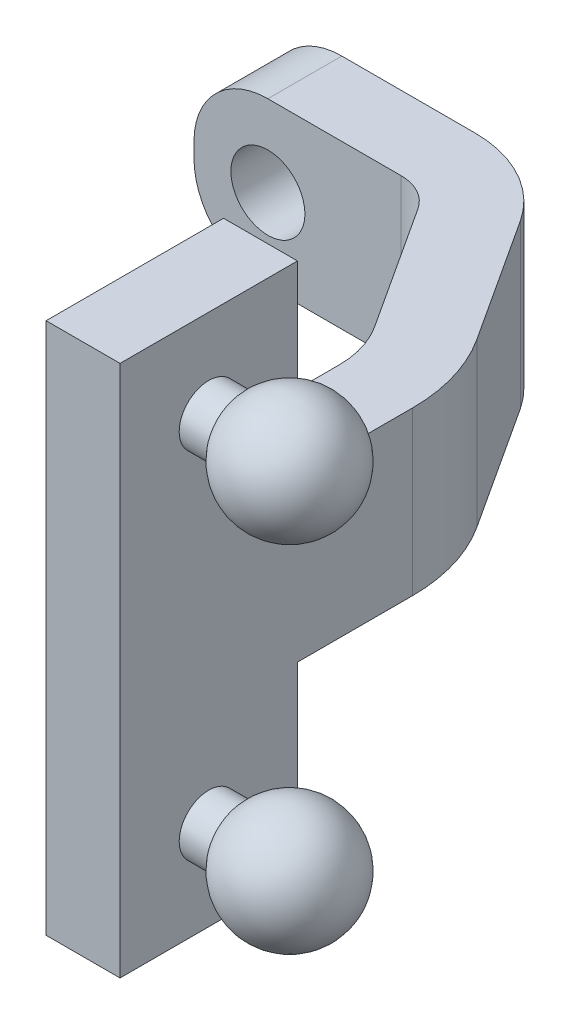
ISO-10303-21;
HEADER;
FILE_DESCRIPTION(('STEP AP214'),'2;1');
FILE_NAME('part.step','',(''),(''),'','','');
FILE_SCHEMA(('AUTOMOTIVE_DESIGN { 1 0 10303 214 1 1 1 1 }'));
ENDSEC;
DATA;
#1=APPLICATION_CONTEXT('core data for automotive mechanical design processes');
#2=APPLICATION_PROTOCOL_DEFINITION('international standard','automotive_design',2000,#1);
#3=PRODUCT_CONTEXT('',#1,'mechanical');
#4=PRODUCT('Part','Part','',(#3));
#5=PRODUCT_RELATED_PRODUCT_CATEGORY('part','',(#4));
#6=PRODUCT_DEFINITION_FORMATION('','',#4);
#7=PRODUCT_DEFINITION_CONTEXT('part definition',#1,'design');
#8=PRODUCT_DEFINITION('design','',#6,#7);
#9=PRODUCT_DEFINITION_SHAPE('','',#8);
#10=(LENGTH_UNIT() NAMED_UNIT(*) SI_UNIT(.MILLI.,.METRE.));
#11=(NAMED_UNIT(*) PLANE_ANGLE_UNIT() SI_UNIT($,.RADIAN.));
#12=(NAMED_UNIT(*) SI_UNIT($,.STERADIAN.) SOLID_ANGLE_UNIT());
#13=UNCERTAINTY_MEASURE_WITH_UNIT(LENGTH_MEASURE(1.E-05),#10,'distance_accuracy_value','');
#14=(GEOMETRIC_REPRESENTATION_CONTEXT(3) GLOBAL_UNCERTAINTY_ASSIGNED_CONTEXT((#13)) GLOBAL_UNIT_ASSIGNED_CONTEXT((#10,
#11,#12)) REPRESENTATION_CONTEXT('',''));
#15=CARTESIAN_POINT('',(0.,0.,0.));
#16=DIRECTION('',(0.,0.,1.));
#17=DIRECTION('',(1.,0.,0.));
#18=AXIS2_PLACEMENT_3D('',#15,#16,#17);
#19=CARTESIAN_POINT('',(0.,2.75,0.));
#20=DIRECTION('',(1.,0.,0.));
#21=DIRECTION('',(0.,0.,-1.));
#22=AXIS2_PLACEMENT_3D('',#19,#20,#21);
#23=PLANE('',#22);
#24=DIRECTION('',(0.,-1.,0.));
#25=VECTOR('',#24,1.);
#26=CARTESIAN_POINT('',(0.,2.75,0.));
#27=LINE('',#26,#25);
#28=CARTESIAN_POINT('',(0.,0.25,0.));
#29=VERTEX_POINT('',#28);
#30=CARTESIAN_POINT('',(0.,-0.25,0.));
#31=VERTEX_POINT('',#30);
#32=EDGE_CURVE('E245',#29,#31,#27,.T.);
#33=ORIENTED_EDGE('',*,*,#32,.T.);
#34=DIRECTION('',(0.,0.,1.));
#35=VECTOR('',#34,1.);
#36=CARTESIAN_POINT('',(0.,-0.25,2.5));
#37=LINE('',#36,#35);
#38=CARTESIAN_POINT('',(0.,-0.25,2.5));
#39=VERTEX_POINT('',#38);
#40=EDGE_CURVE('E296',#31,#39,#37,.T.);
#41=ORIENTED_EDGE('',*,*,#40,.T.);
#42=DIRECTION('',(0.,-1.,0.));
#43=VECTOR('',#42,1.);
#44=CARTESIAN_POINT('',(0.,2.75,2.5));
#45=LINE('',#44,#43);
#46=CARTESIAN_POINT('',(0.,0.25,2.5));
#47=VERTEX_POINT('',#46);
#48=EDGE_CURVE('E291',#47,#39,#45,.T.);
#49=ORIENTED_EDGE('',*,*,#48,.F.);
#50=DIRECTION('',(0.,0.,1.));
#51=VECTOR('',#50,1.);
#52=CARTESIAN_POINT('',(0.,0.25,0.));
#53=LINE('',#52,#51);
#54=EDGE_CURVE('E294',#47,#29,#53,.F.);
#55=ORIENTED_EDGE('',*,*,#54,.T.);
#56=EDGE_LOOP('',(#33,#41,#49,#55));
#57=FACE_BOUND('',#56,.T.);
#58=ADVANCED_FACE('F41',(#57),#23,.F.);
#59=CARTESIAN_POINT('',(0.,2.75,2.5));
#60=DIRECTION('',(0.,0.,-1.));
#61=DIRECTION('',(-1.,0.,0.));
#62=AXIS2_PLACEMENT_3D('',#59,#60,#61);
#63=PLANE('',#62);
#64=CARTESIAN_POINT('',(2.5,0.,2.5));
#65=DIRECTION('',(0.,0.,-1.));
#66=DIRECTION('',(-1.,0.,0.));
#67=AXIS2_PLACEMENT_3D('',#64,#65,#66);
#68=CIRCLE('',#67,1.25);
#69=CARTESIAN_POINT('',(1.25,0.,2.5));
#70=VERTEX_POINT('',#69);
#71=EDGE_CURVE('E220',#70,#70,#68,.T.);
#72=ORIENTED_EDGE('',*,*,#71,.T.);
#73=EDGE_LOOP('',(#72));
#74=FACE_BOUND('',#73,.T.);
#75=ORIENTED_EDGE('',*,*,#48,.T.);
#76=CARTESIAN_POINT('',(2.5,-0.25,2.5));
#77=DIRECTION('',(0.,0.,-1.));
#78=DIRECTION('',(-1.,0.,0.));
#79=AXIS2_PLACEMENT_3D('',#76,#77,#78);
#80=CIRCLE('',#79,2.5);
#81=CARTESIAN_POINT('',(2.5,-2.75,2.5));
#82=VERTEX_POINT('',#81);
#83=EDGE_CURVE('E301',#39,#82,#80,.F.);
#84=ORIENTED_EDGE('',*,*,#83,.T.);
#85=DIRECTION('',(1.,0.,0.));
#86=VECTOR('',#85,1.);
#87=CARTESIAN_POINT('',(0.,-2.75,2.5));
#88=LINE('',#87,#86);
#89=CARTESIAN_POINT('',(7.,-2.75,2.5));
#90=VERTEX_POINT('',#89);
#91=EDGE_CURVE('E223',#82,#90,#88,.T.);
#92=ORIENTED_EDGE('',*,*,#91,.T.);
#93=DIRECTION('',(0.,-1.,0.));
#94=VECTOR('',#93,1.);
#95=CARTESIAN_POINT('',(7.,2.75,2.5));
#96=LINE('',#95,#94);
#97=CARTESIAN_POINT('',(7.,2.75,2.5));
#98=VERTEX_POINT('',#97);
#99=EDGE_CURVE('E288',#98,#90,#96,.T.);
#100=ORIENTED_EDGE('',*,*,#99,.F.);
#101=DIRECTION('',(1.,0.,0.));
#102=VECTOR('',#101,1.);
#103=CARTESIAN_POINT('',(0.,2.75,2.5));
#104=LINE('',#103,#102);
#105=CARTESIAN_POINT('',(2.5,2.75,2.5));
#106=VERTEX_POINT('',#105);
#107=EDGE_CURVE('E224',#106,#98,#104,.T.);
#108=ORIENTED_EDGE('',*,*,#107,.F.);
#109=CARTESIAN_POINT('',(2.5,0.25,2.5));
#110=DIRECTION('',(0.,0.,-1.));
#111=DIRECTION('',(-1.,0.,0.));
#112=AXIS2_PLACEMENT_3D('',#109,#110,#111);
#113=CIRCLE('',#112,2.5);
#114=EDGE_CURVE('E299',#106,#47,#113,.F.);
#115=ORIENTED_EDGE('',*,*,#114,.T.);
#116=EDGE_LOOP('',(#75,#84,#92,#100,#108,#115));
#117=FACE_BOUND('',#116,.T.);
#118=ADVANCED_FACE('F384',(#74,#117),#63,.F.);
#119=CARTESIAN_POINT('',(7.,2.75,4.));
#120=DIRECTION('',(0.,-1.,0.));
#121=DIRECTION('',(0.,0.,-1.));
#122=AXIS2_PLACEMENT_3D('',#119,#120,#121);
#123=CYLINDRICAL_SURFACE('',#122,1.5);
#124=CARTESIAN_POINT('',(7.,-2.75,4.));
#125=DIRECTION('',(0.,-1.,0.));
#126=DIRECTION('',(0.,0.,-1.));
#127=AXIS2_PLACEMENT_3D('',#124,#125,#126);
#128=CIRCLE('',#127,1.5);
#129=CARTESIAN_POINT('',(8.25754577081105,-2.75,3.18233342106012));
#130=VERTEX_POINT('',#129);
#131=EDGE_CURVE('E247',#90,#130,#128,.T.);
#132=ORIENTED_EDGE('',*,*,#131,.T.);
#133=DIRECTION('',(0.,-1.,0.));
#134=VECTOR('',#133,1.);
#135=CARTESIAN_POINT('',(8.25754577081105,2.75,3.18233342106012));
#136=LINE('',#135,#134);
#137=CARTESIAN_POINT('',(8.25754577081105,2.75,3.18233342106012));
#138=VERTEX_POINT('',#137);
#139=EDGE_CURVE('E285',#138,#130,#136,.T.);
#140=ORIENTED_EDGE('',*,*,#139,.F.);
#141=CARTESIAN_POINT('',(7.,2.75,4.));
#142=DIRECTION('',(0.,-1.,0.));
#143=DIRECTION('',(0.,0.,-1.));
#144=AXIS2_PLACEMENT_3D('',#141,#142,#143);
#145=CIRCLE('',#144,1.5);
#146=EDGE_CURVE('E226',#98,#138,#145,.T.);
#147=ORIENTED_EDGE('',*,*,#146,.F.);
#148=ORIENTED_EDGE('',*,*,#99,.T.);
#149=EDGE_LOOP('',(#132,#140,#147,#148));
#150=FACE_BOUND('',#149,.T.);
#151=ADVANCED_FACE('F347',(#150),#123,.F.);
#152=CARTESIAN_POINT('',(8.25754577081105,2.75,3.18233342106012));
#153=DIRECTION('',(0.838363847207363,0.,-0.54511105262659));
#154=DIRECTION('',(-0.54511105262659,0.,-0.838363847207363));
#155=AXIS2_PLACEMENT_3D('',#152,#153,#154);
#156=PLANE('',#155);
#157=DIRECTION('',(0.54511105262659,0.,0.838363847207363));
#158=VECTOR('',#157,1.);
#159=CARTESIAN_POINT('',(8.25754577081105,-2.75,3.18233342106012));
#160=LINE('',#159,#158);
#161=CARTESIAN_POINT('',(10.9902966016318,-2.75,7.38521921643481));
#162=VERTEX_POINT('',#161);
#163=EDGE_CURVE('E249',#130,#162,#160,.T.);
#164=ORIENTED_EDGE('',*,*,#163,.T.);
#165=DIRECTION('',(0.,-1.,0.));
#166=VECTOR('',#165,1.);
#167=CARTESIAN_POINT('',(10.9902966016318,2.75,7.38521921643481));
#168=LINE('',#167,#166);
#169=CARTESIAN_POINT('',(10.9902966016318,2.75,7.38521921643481));
#170=VERTEX_POINT('',#169);
#171=EDGE_CURVE('E282',#170,#162,#168,.T.);
#172=ORIENTED_EDGE('',*,*,#171,.F.);
#173=DIRECTION('',(0.54511105262659,0.,0.838363847207363));
#174=VECTOR('',#173,1.);
#175=CARTESIAN_POINT('',(8.25754577081105,2.75,3.18233342106012));
#176=LINE('',#175,#174);
#177=EDGE_CURVE('E229',#138,#170,#176,.T.);
#178=ORIENTED_EDGE('',*,*,#177,.F.);
#179=ORIENTED_EDGE('',*,*,#139,.T.);
#180=EDGE_LOOP('',(#164,#172,#178,#179));
#181=FACE_BOUND('',#180,.T.);
#182=ADVANCED_FACE('F343',(#181),#156,.F.);
#183=CARTESIAN_POINT('',(8.34660028365028,2.75,9.10417225516659));
#184=DIRECTION('',(0.,-1.,0.));
#185=DIRECTION('',(0.,0.,-1.));
#186=AXIS2_PLACEMENT_3D('',#183,#184,#185);
#187=CYLINDRICAL_SURFACE('',#186,3.15339971634972);
#188=CARTESIAN_POINT('',(8.34660028365028,-2.75,9.10417225516659));
#189=DIRECTION('',(0.,-1.,0.));
#190=DIRECTION('',(0.,0.,1.));
#191=AXIS2_PLACEMENT_3D('',#188,#189,#190);
#192=CIRCLE('',#191,3.15339971634972);
#193=CARTESIAN_POINT('',(11.5,-2.75,9.10417225516659));
#194=VERTEX_POINT('',#193);
#195=EDGE_CURVE('E251',#162,#194,#192,.T.);
#196=ORIENTED_EDGE('',*,*,#195,.T.);
#197=DIRECTION('',(0.,-1.,0.));
#198=VECTOR('',#197,1.);
#199=CARTESIAN_POINT('',(11.5,2.75,9.10417225516659));
#200=LINE('',#199,#198);
#201=CARTESIAN_POINT('',(11.5,2.75,9.10417225516659));
#202=VERTEX_POINT('',#201);
#203=EDGE_CURVE('E179',#202,#194,#200,.T.);
#204=ORIENTED_EDGE('',*,*,#203,.F.);
#205=CARTESIAN_POINT('',(8.34660028365028,2.75,9.10417225516659));
#206=DIRECTION('',(0.,-1.,0.));
#207=DIRECTION('',(0.,0.,1.));
#208=AXIS2_PLACEMENT_3D('',#205,#206,#207);
#209=CIRCLE('',#208,3.15339971634972);
#210=EDGE_CURVE('E231',#170,#202,#209,.T.);
#211=ORIENTED_EDGE('',*,*,#210,.F.);
#212=ORIENTED_EDGE('',*,*,#171,.T.);
#213=EDGE_LOOP('',(#196,#204,#211,#212));
#214=FACE_BOUND('',#213,.T.);
#215=ADVANCED_FACE('F339',(#214),#187,.F.);
#216=CARTESIAN_POINT('',(11.5,2.75,9.10417225516659));
#217=DIRECTION('',(1.,0.,0.));
#218=DIRECTION('',(0.,0.,-1.));
#219=AXIS2_PLACEMENT_3D('',#216,#217,#218);
#220=PLANE('',#219);
#221=DIRECTION('',(0.,0.,1.));
#222=VECTOR('',#221,1.);
#223=CARTESIAN_POINT('',(11.5,-2.75,9.10417225516659));
#224=LINE('',#223,#222);
#225=CARTESIAN_POINT('',(11.5,-2.75,13.));
#226=VERTEX_POINT('',#225);
#227=EDGE_CURVE('E253',#194,#226,#224,.T.);
#228=ORIENTED_EDGE('',*,*,#227,.T.);
#229=DIRECTION('',(0.,-1.,0.));
#230=VECTOR('',#229,1.);
#231=CARTESIAN_POINT('',(11.5,8.99999999999999,13.));
#232=LINE('',#231,#230);
#233=CARTESIAN_POINT('',(11.5,-9.,13.));
#234=VERTEX_POINT('',#233);
#235=EDGE_CURVE('E193',#226,#234,#232,.T.);
#236=ORIENTED_EDGE('',*,*,#235,.T.);
#237=DIRECTION('',(0.,0.,1.));
#238=VECTOR('',#237,1.);
#239=CARTESIAN_POINT('',(11.5,-9.,13.));
#240=LINE('',#239,#238);
#241=CARTESIAN_POINT('',(11.5,-9.,19.));
#242=VERTEX_POINT('',#241);
#243=EDGE_CURVE('E175',#234,#242,#240,.T.);
#244=ORIENTED_EDGE('',*,*,#243,.T.);
#245=DIRECTION('',(0.,-1.,0.));
#246=VECTOR('',#245,1.);
#247=CARTESIAN_POINT('',(11.5,2.75,19.));
#248=LINE('',#247,#246);
#249=CARTESIAN_POINT('',(11.5,9.,19.));
#250=VERTEX_POINT('',#249);
#251=EDGE_CURVE('E167',#250,#242,#248,.T.);
#252=ORIENTED_EDGE('',*,*,#251,.F.);
#253=DIRECTION('',(0.,0.,-1.));
#254=VECTOR('',#253,1.);
#255=CARTESIAN_POINT('',(11.5,8.99999999999999,13.));
#256=LINE('',#255,#254);
#257=CARTESIAN_POINT('',(11.5,8.99999999999999,13.));
#258=VERTEX_POINT('',#257);
#259=EDGE_CURVE('E173',#250,#258,#256,.T.);
#260=ORIENTED_EDGE('',*,*,#259,.T.);
#261=CARTESIAN_POINT('',(11.5,2.75,13.));
#262=VERTEX_POINT('',#261);
#263=EDGE_CURVE('E196',#258,#262,#232,.T.);
#264=ORIENTED_EDGE('',*,*,#263,.T.);
#265=DIRECTION('',(0.,0.,1.));
#266=VECTOR('',#265,1.);
#267=CARTESIAN_POINT('',(11.5,2.75,9.10417225516659));
#268=LINE('',#267,#266);
#269=EDGE_CURVE('E56',#202,#262,#268,.T.);
#270=ORIENTED_EDGE('',*,*,#269,.F.);
#271=ORIENTED_EDGE('',*,*,#203,.T.);
#272=EDGE_LOOP('',(#228,#236,#244,#252,#260,#264,#270,#271));
#273=FACE_BOUND('',#272,.T.);
#274=ADVANCED_FACE('F170',(#273),#220,.F.);
#275=CARTESIAN_POINT('',(11.5,2.75,19.));
#276=DIRECTION('',(0.,0.,-1.));
#277=DIRECTION('',(-1.,0.,0.));
#278=AXIS2_PLACEMENT_3D('',#275,#276,#277);
#279=PLANE('',#278);
#280=ORIENTED_EDGE('',*,*,#251,.T.);
#281=DIRECTION('',(-1.,0.,0.));
#282=VECTOR('',#281,1.);
#283=CARTESIAN_POINT('',(32.9736659610103,-9.,19.));
#284=LINE('',#283,#282);
#285=CARTESIAN_POINT('',(14.,-9.,19.));
#286=VERTEX_POINT('',#285);
#287=EDGE_CURVE('E206',#286,#242,#284,.T.);
#288=ORIENTED_EDGE('',*,*,#287,.F.);
#289=DIRECTION('',(0.,-1.,0.));
#290=VECTOR('',#289,1.);
#291=CARTESIAN_POINT('',(14.,2.75,19.));
#292=LINE('',#291,#290);
#293=CARTESIAN_POINT('',(14.,9.,19.));
#294=VERTEX_POINT('',#293);
#295=EDGE_CURVE('E180',#294,#286,#292,.T.);
#296=ORIENTED_EDGE('',*,*,#295,.F.);
#297=DIRECTION('',(-1.,0.,0.));
#298=VECTOR('',#297,1.);
#299=CARTESIAN_POINT('',(32.9736659610103,9.,19.));
#300=LINE('',#299,#298);
#301=EDGE_CURVE('E183',#294,#250,#300,.T.);
#302=ORIENTED_EDGE('',*,*,#301,.T.);
#303=EDGE_LOOP('',(#280,#288,#296,#302));
#304=FACE_BOUND('',#303,.T.);
#305=ADVANCED_FACE('F184',(#304),#279,.F.);
#306=CARTESIAN_POINT('',(14.,2.75,9.10417225516659));
#307=DIRECTION('',(-1.,0.,0.));
#308=DIRECTION('',(0.,0.,1.));
#309=AXIS2_PLACEMENT_3D('',#306,#307,#308);
#310=PLANE('',#309);
#311=CARTESIAN_POINT('',(14.,-5.99999999999999,16.));
#312=DIRECTION('',(-1.,0.,0.));
#313=DIRECTION('',(0.,0.,-1.));
#314=AXIS2_PLACEMENT_3D('',#311,#312,#313);
#315=CIRCLE('',#314,1.);
#316=CARTESIAN_POINT('',(14.,-5.99999999999999,15.));
#317=VERTEX_POINT('',#316);
#318=EDGE_CURVE('E199',#317,#317,#315,.T.);
#319=ORIENTED_EDGE('',*,*,#318,.T.);
#320=EDGE_LOOP('',(#319));
#321=FACE_BOUND('',#320,.T.);
#322=CARTESIAN_POINT('',(14.,5.99999999999999,16.));
#323=DIRECTION('',(-1.,0.,0.));
#324=DIRECTION('',(0.,0.,1.));
#325=AXIS2_PLACEMENT_3D('',#322,#323,#324);
#326=CIRCLE('',#325,1.);
#327=CARTESIAN_POINT('',(14.,5.99999999999999,17.));
#328=VERTEX_POINT('',#327);
#329=EDGE_CURVE('E11',#328,#328,#326,.F.);
#330=ORIENTED_EDGE('',*,*,#329,.F.);
#331=EDGE_LOOP('',(#330));
#332=FACE_BOUND('',#331,.T.);
#333=DIRECTION('',(0.,0.,-1.));
#334=VECTOR('',#333,1.);
#335=CARTESIAN_POINT('',(14.,2.75,9.10417225516659));
#336=LINE('',#335,#334);
#337=CARTESIAN_POINT('',(14.,2.75,13.));
#338=VERTEX_POINT('',#337);
#339=CARTESIAN_POINT('',(14.,2.75,9.10417225516659));
#340=VERTEX_POINT('',#339);
#341=EDGE_CURVE('E234',#338,#340,#336,.T.);
#342=ORIENTED_EDGE('',*,*,#341,.F.);
#343=DIRECTION('',(0.,1.,0.));
#344=VECTOR('',#343,1.);
#345=CARTESIAN_POINT('',(14.,8.99999999999999,13.));
#346=LINE('',#345,#344);
#347=CARTESIAN_POINT('',(14.,8.99999999999999,13.));
#348=VERTEX_POINT('',#347);
#349=EDGE_CURVE('E208',#338,#348,#346,.T.);
#350=ORIENTED_EDGE('',*,*,#349,.T.);
#351=DIRECTION('',(0.,0.,1.));
#352=VECTOR('',#351,1.);
#353=CARTESIAN_POINT('',(14.,8.99999999999999,13.));
#354=LINE('',#353,#352);
#355=EDGE_CURVE('E213',#348,#294,#354,.T.);
#356=ORIENTED_EDGE('',*,*,#355,.T.);
#357=ORIENTED_EDGE('',*,*,#295,.T.);
#358=DIRECTION('',(0.,0.,-1.));
#359=VECTOR('',#358,1.);
#360=CARTESIAN_POINT('',(14.,-9.,13.));
#361=LINE('',#360,#359);
#362=CARTESIAN_POINT('',(14.,-9.,13.));
#363=VERTEX_POINT('',#362);
#364=EDGE_CURVE('E202',#286,#363,#361,.T.);
#365=ORIENTED_EDGE('',*,*,#364,.T.);
#366=CARTESIAN_POINT('',(14.,-2.75,13.));
#367=VERTEX_POINT('',#366);
#368=EDGE_CURVE('E64',#363,#367,#346,.T.);
#369=ORIENTED_EDGE('',*,*,#368,.T.);
#370=DIRECTION('',(0.,0.,-1.));
#371=VECTOR('',#370,1.);
#372=CARTESIAN_POINT('',(14.,-2.75,9.10417225516659));
#373=LINE('',#372,#371);
#374=CARTESIAN_POINT('',(14.,-2.75,9.10417225516659));
#375=VERTEX_POINT('',#374);
#376=EDGE_CURVE('E255',#367,#375,#373,.T.);
#377=ORIENTED_EDGE('',*,*,#376,.T.);
#378=DIRECTION('',(0.,-1.,0.));
#379=VECTOR('',#378,1.);
#380=CARTESIAN_POINT('',(14.,2.75,9.10417225516659));
#381=LINE('',#380,#379);
#382=EDGE_CURVE('E276',#340,#375,#381,.T.);
#383=ORIENTED_EDGE('',*,*,#382,.F.);
#384=EDGE_LOOP('',(#342,#350,#356,#357,#365,#369,#377,#383));
#385=FACE_BOUND('',#384,.T.);
#386=ADVANCED_FACE('F322',(#321,#332,#385),#310,.F.);
#387=CARTESIAN_POINT('',(8.34660028365028,2.75,9.10417225516659));
#388=DIRECTION('',(0.,-1.,0.));
#389=DIRECTION('',(0.,0.,-1.));
#390=AXIS2_PLACEMENT_3D('',#387,#388,#389);
#391=CYLINDRICAL_SURFACE('',#390,5.65339971634972);
#392=CARTESIAN_POINT('',(8.34660028365028,-2.75,9.10417225516659));
#393=DIRECTION('',(0.,1.,0.));
#394=DIRECTION('',(0.,0.,-1.));
#395=AXIS2_PLACEMENT_3D('',#392,#393,#394);
#396=CIRCLE('',#395,5.65339971634972);
#397=CARTESIAN_POINT('',(13.0862062196502,-2.75,6.02244158486833));
#398=VERTEX_POINT('',#397);
#399=EDGE_CURVE('E257',#375,#398,#396,.T.);
#400=ORIENTED_EDGE('',*,*,#399,.T.);
#401=DIRECTION('',(0.,-1.,0.));
#402=VECTOR('',#401,1.);
#403=CARTESIAN_POINT('',(13.0862062196502,2.75,6.02244158486833));
#404=LINE('',#403,#402);
#405=CARTESIAN_POINT('',(13.0862062196502,2.75,6.02244158486833));
#406=VERTEX_POINT('',#405);
#407=EDGE_CURVE('E273',#406,#398,#404,.T.);
#408=ORIENTED_EDGE('',*,*,#407,.F.);
#409=CARTESIAN_POINT('',(8.34660028365028,2.75,9.10417225516659));
#410=DIRECTION('',(0.,1.,0.));
#411=DIRECTION('',(0.,0.,-1.));
#412=AXIS2_PLACEMENT_3D('',#409,#410,#411);
#413=CIRCLE('',#412,5.65339971634972);
#414=EDGE_CURVE('E236',#340,#406,#413,.T.);
#415=ORIENTED_EDGE('',*,*,#414,.F.);
#416=ORIENTED_EDGE('',*,*,#382,.T.);
#417=EDGE_LOOP('',(#400,#408,#415,#416));
#418=FACE_BOUND('',#417,.T.);
#419=ADVANCED_FACE('F325',(#418),#391,.T.);
#420=CARTESIAN_POINT('',(10.3534553888295,2.75,1.81955578949364));
#421=DIRECTION('',(-0.838363847207363,0.,0.54511105262659));
#422=DIRECTION('',(0.54511105262659,0.,0.838363847207363));
#423=AXIS2_PLACEMENT_3D('',#420,#421,#422);
#424=PLANE('',#423);
#425=DIRECTION('',(-0.54511105262659,0.,-0.838363847207363));
#426=VECTOR('',#425,1.);
#427=CARTESIAN_POINT('',(10.3534553888295,-2.75,1.81955578949364));
#428=LINE('',#427,#426);
#429=CARTESIAN_POINT('',(10.3534553888295,-2.75,1.81955578949364));
#430=VERTEX_POINT('',#429);
#431=EDGE_CURVE('E259',#398,#430,#428,.T.);
#432=ORIENTED_EDGE('',*,*,#431,.T.);
#433=DIRECTION('',(0.,-1.,0.));
#434=VECTOR('',#433,1.);
#435=CARTESIAN_POINT('',(10.3534553888295,2.75,1.81955578949364));
#436=LINE('',#435,#434);
#437=CARTESIAN_POINT('',(10.3534553888295,2.75,1.81955578949364));
#438=VERTEX_POINT('',#437);
#439=EDGE_CURVE('E270',#438,#430,#436,.T.);
#440=ORIENTED_EDGE('',*,*,#439,.F.);
#441=DIRECTION('',(-0.54511105262659,0.,-0.838363847207363));
#442=VECTOR('',#441,1.);
#443=CARTESIAN_POINT('',(10.3534553888295,2.75,1.81955578949364));
#444=LINE('',#443,#442);
#445=EDGE_CURVE('E238',#406,#438,#444,.T.);
#446=ORIENTED_EDGE('',*,*,#445,.F.);
#447=ORIENTED_EDGE('',*,*,#407,.T.);
#448=EDGE_LOOP('',(#432,#440,#446,#447));
#449=FACE_BOUND('',#448,.T.);
#450=ADVANCED_FACE('F374',(#449),#424,.F.);
#451=CARTESIAN_POINT('',(7.,2.75,4.));
#452=DIRECTION('',(0.,-1.,0.));
#453=DIRECTION('',(0.,0.,-1.));
#454=AXIS2_PLACEMENT_3D('',#451,#452,#453);
#455=CYLINDRICAL_SURFACE('',#454,4.);
#456=CARTESIAN_POINT('',(7.,-2.75,4.));
#457=DIRECTION('',(0.,1.,0.));
#458=DIRECTION('',(0.,0.,-1.));
#459=AXIS2_PLACEMENT_3D('',#456,#457,#458);
#460=CIRCLE('',#459,4.);
#461=CARTESIAN_POINT('',(7.,-2.75,0.));
#462=VERTEX_POINT('',#461);
#463=EDGE_CURVE('E261',#430,#462,#460,.T.);
#464=ORIENTED_EDGE('',*,*,#463,.T.);
#465=DIRECTION('',(0.,-1.,0.));
#466=VECTOR('',#465,1.);
#467=CARTESIAN_POINT('',(7.,2.75,0.));
#468=LINE('',#467,#466);
#469=CARTESIAN_POINT('',(7.,2.75,0.));
#470=VERTEX_POINT('',#469);
#471=EDGE_CURVE('E267',#470,#462,#468,.T.);
#472=ORIENTED_EDGE('',*,*,#471,.F.);
#473=CARTESIAN_POINT('',(7.,2.75,4.));
#474=DIRECTION('',(0.,1.,0.));
#475=DIRECTION('',(0.,0.,-1.));
#476=AXIS2_PLACEMENT_3D('',#473,#474,#475);
#477=CIRCLE('',#476,4.);
#478=EDGE_CURVE('E240',#438,#470,#477,.T.);
#479=ORIENTED_EDGE('',*,*,#478,.F.);
#480=ORIENTED_EDGE('',*,*,#439,.T.);
#481=EDGE_LOOP('',(#464,#472,#479,#480));
#482=FACE_BOUND('',#481,.T.);
#483=ADVANCED_FACE('F371',(#482),#455,.T.);
#484=CARTESIAN_POINT('',(0.,2.75,0.));
#485=DIRECTION('',(0.,0.,1.));
#486=DIRECTION('',(1.,0.,0.));
#487=AXIS2_PLACEMENT_3D('',#484,#485,#486);
#488=PLANE('',#487);
#489=CARTESIAN_POINT('',(2.5,0.,0.));
#490=DIRECTION('',(0.,0.,-1.));
#491=DIRECTION('',(-1.,0.,0.));
#492=AXIS2_PLACEMENT_3D('',#489,#490,#491);
#493=CIRCLE('',#492,1.25);
#494=CARTESIAN_POINT('',(1.25,0.,0.));
#495=VERTEX_POINT('',#494);
#496=EDGE_CURVE('E217',#495,#495,#493,.T.);
#497=ORIENTED_EDGE('',*,*,#496,.F.);
#498=EDGE_LOOP('',(#497));
#499=FACE_BOUND('',#498,.T.);
#500=DIRECTION('',(-1.,0.,0.));
#501=VECTOR('',#500,1.);
#502=CARTESIAN_POINT('',(0.,-2.75,0.));
#503=LINE('',#502,#501);
#504=CARTESIAN_POINT('',(2.5,-2.75,0.));
#505=VERTEX_POINT('',#504);
#506=EDGE_CURVE('E227',#462,#505,#503,.T.);
#507=ORIENTED_EDGE('',*,*,#506,.T.);
#508=CARTESIAN_POINT('',(2.5,-0.25,0.));
#509=DIRECTION('',(0.,0.,1.));
#510=DIRECTION('',(1.,0.,0.));
#511=AXIS2_PLACEMENT_3D('',#508,#509,#510);
#512=CIRCLE('',#511,2.5);
#513=EDGE_CURVE('E307',#505,#31,#512,.F.);
#514=ORIENTED_EDGE('',*,*,#513,.T.);
#515=ORIENTED_EDGE('',*,*,#32,.F.);
#516=CARTESIAN_POINT('',(2.5,0.25,0.));
#517=DIRECTION('',(0.,0.,1.));
#518=DIRECTION('',(1.,0.,0.));
#519=AXIS2_PLACEMENT_3D('',#516,#517,#518);
#520=CIRCLE('',#519,2.5);
#521=CARTESIAN_POINT('',(2.5,2.75,0.));
#522=VERTEX_POINT('',#521);
#523=EDGE_CURVE('E305',#29,#522,#520,.F.);
#524=ORIENTED_EDGE('',*,*,#523,.T.);
#525=DIRECTION('',(-1.,0.,0.));
#526=VECTOR('',#525,1.);
#527=CARTESIAN_POINT('',(0.,2.75,0.));
#528=LINE('',#527,#526);
#529=EDGE_CURVE('E242',#470,#522,#528,.T.);
#530=ORIENTED_EDGE('',*,*,#529,.F.);
#531=ORIENTED_EDGE('',*,*,#471,.T.);
#532=EDGE_LOOP('',(#507,#514,#515,#524,#530,#531));
#533=FACE_BOUND('',#532,.T.);
#534=ADVANCED_FACE('F359',(#499,#533),#488,.F.);
#535=CARTESIAN_POINT('',(7.,2.75,4.));
#536=DIRECTION('',(0.,-1.,0.));
#537=DIRECTION('',(0.,0.,-1.));
#538=AXIS2_PLACEMENT_3D('',#535,#536,#537);
#539=PLANE('',#538);
#540=ORIENTED_EDGE('',*,*,#269,.T.);
#541=DIRECTION('',(1.,0.,0.));
#542=VECTOR('',#541,1.);
#543=CARTESIAN_POINT('',(7.00000000000001,2.75,13.));
#544=LINE('',#543,#542);
#545=EDGE_CURVE('E215',#262,#338,#544,.T.);
#546=ORIENTED_EDGE('',*,*,#545,.T.);
#547=ORIENTED_EDGE('',*,*,#341,.T.);
#548=ORIENTED_EDGE('',*,*,#414,.T.);
#549=ORIENTED_EDGE('',*,*,#445,.T.);
#550=ORIENTED_EDGE('',*,*,#478,.T.);
#551=ORIENTED_EDGE('',*,*,#529,.T.);
#552=DIRECTION('',(0.,0.,1.));
#553=VECTOR('',#552,1.);
#554=CARTESIAN_POINT('',(2.5,2.75,4.));
#555=LINE('',#554,#553);
#556=EDGE_CURVE('E309',#522,#106,#555,.T.);
#557=ORIENTED_EDGE('',*,*,#556,.T.);
#558=ORIENTED_EDGE('',*,*,#107,.T.);
#559=ORIENTED_EDGE('',*,*,#146,.T.);
#560=ORIENTED_EDGE('',*,*,#177,.T.);
#561=ORIENTED_EDGE('',*,*,#210,.T.);
#562=EDGE_LOOP('',(#540,#546,#547,#548,#549,#550,#551,#557,#558,#559,#560,#561));
#563=FACE_BOUND('',#562,.T.);
#564=ADVANCED_FACE('F328',(#563),#539,.F.);
#565=CARTESIAN_POINT('',(7.,-2.75,4.));
#566=DIRECTION('',(0.,-1.,0.));
#567=DIRECTION('',(0.,0.,-1.));
#568=AXIS2_PLACEMENT_3D('',#565,#566,#567);
#569=PLANE('',#568);
#570=DIRECTION('',(1.,0.,0.));
#571=VECTOR('',#570,1.);
#572=CARTESIAN_POINT('',(7.00000000000001,-2.75,13.));
#573=LINE('',#572,#571);
#574=EDGE_CURVE('E49',#226,#367,#573,.T.);
#575=ORIENTED_EDGE('',*,*,#574,.F.);
#576=ORIENTED_EDGE('',*,*,#227,.F.);
#577=ORIENTED_EDGE('',*,*,#195,.F.);
#578=ORIENTED_EDGE('',*,*,#163,.F.);
#579=ORIENTED_EDGE('',*,*,#131,.F.);
#580=ORIENTED_EDGE('',*,*,#91,.F.);
#581=DIRECTION('',(0.,0.,1.));
#582=VECTOR('',#581,1.);
#583=CARTESIAN_POINT('',(2.5,-2.75,0.));
#584=LINE('',#583,#582);
#585=EDGE_CURVE('E303',#82,#505,#584,.F.);
#586=ORIENTED_EDGE('',*,*,#585,.T.);
#587=ORIENTED_EDGE('',*,*,#506,.F.);
#588=ORIENTED_EDGE('',*,*,#463,.F.);
#589=ORIENTED_EDGE('',*,*,#431,.F.);
#590=ORIENTED_EDGE('',*,*,#399,.F.);
#591=ORIENTED_EDGE('',*,*,#376,.F.);
#592=EDGE_LOOP('',(#575,#576,#577,#578,#579,#580,#586,#587,#588,#589,#590,#591));
#593=FACE_BOUND('',#592,.T.);
#594=ADVANCED_FACE('F319',(#593),#569,.T.);
#595=CARTESIAN_POINT('',(2.5,0.,10.));
#596=DIRECTION('',(0.,0.,-1.));
#597=DIRECTION('',(-1.,0.,0.));
#598=AXIS2_PLACEMENT_3D('',#595,#596,#597);
#599=CYLINDRICAL_SURFACE('',#598,1.25);
#600=ORIENTED_EDGE('',*,*,#496,.T.);
#601=EDGE_LOOP('',(#600));
#602=FACE_BOUND('',#601,.T.);
#603=ORIENTED_EDGE('',*,*,#71,.F.);
#604=EDGE_LOOP('',(#603));
#605=FACE_BOUND('',#604,.T.);
#606=ADVANCED_FACE('F394',(#602,#605),#599,.F.);
#607=CARTESIAN_POINT('',(2.5,-0.25,0.));
#608=DIRECTION('',(0.,0.,-1.));
#609=DIRECTION('',(-1.,0.,0.));
#610=AXIS2_PLACEMENT_3D('',#607,#608,#609);
#611=CYLINDRICAL_SURFACE('',#610,2.5);
#612=ORIENTED_EDGE('',*,*,#513,.F.);
#613=ORIENTED_EDGE('',*,*,#585,.F.);
#614=ORIENTED_EDGE('',*,*,#83,.F.);
#615=ORIENTED_EDGE('',*,*,#40,.F.);
#616=EDGE_LOOP('',(#612,#613,#614,#615));
#617=FACE_BOUND('',#616,.T.);
#618=ADVANCED_FACE('F355',(#617),#611,.T.);
#619=CARTESIAN_POINT('',(2.5,0.25,4.));
#620=DIRECTION('',(0.,0.,1.));
#621=DIRECTION('',(1.,0.,0.));
#622=AXIS2_PLACEMENT_3D('',#619,#620,#621);
#623=CYLINDRICAL_SURFACE('',#622,2.5);
#624=ORIENTED_EDGE('',*,*,#523,.F.);
#625=ORIENTED_EDGE('',*,*,#54,.F.);
#626=ORIENTED_EDGE('',*,*,#114,.F.);
#627=ORIENTED_EDGE('',*,*,#556,.F.);
#628=EDGE_LOOP('',(#624,#625,#626,#627));
#629=FACE_BOUND('',#628,.T.);
#630=ADVANCED_FACE('F43',(#629),#623,.T.);
#631=CARTESIAN_POINT('',(32.9736659610103,-9.,13.));
#632=DIRECTION('',(0.,-1.,0.));
#633=DIRECTION('',(0.,0.,-1.));
#634=AXIS2_PLACEMENT_3D('',#631,#632,#633);
#635=PLANE('',#634);
#636=ORIENTED_EDGE('',*,*,#364,.F.);
#637=ORIENTED_EDGE('',*,*,#287,.T.);
#638=ORIENTED_EDGE('',*,*,#243,.F.);
#639=DIRECTION('',(-1.,0.,0.));
#640=VECTOR('',#639,1.);
#641=CARTESIAN_POINT('',(32.9736659610103,-9.,13.));
#642=LINE('',#641,#640);
#643=EDGE_CURVE('E209',#363,#234,#642,.T.);
#644=ORIENTED_EDGE('',*,*,#643,.F.);
#645=EDGE_LOOP('',(#636,#637,#638,#644));
#646=FACE_BOUND('',#645,.T.);
#647=ADVANCED_FACE('F399',(#646),#635,.T.);
#648=CARTESIAN_POINT('',(32.9736659610103,8.99999999999999,13.));
#649=DIRECTION('',(0.,0.,-1.));
#650=DIRECTION('',(-1.,0.,0.));
#651=AXIS2_PLACEMENT_3D('',#648,#649,#650);
#652=PLANE('',#651);
#653=ORIENTED_EDGE('',*,*,#235,.F.);
#654=ORIENTED_EDGE('',*,*,#574,.T.);
#655=ORIENTED_EDGE('',*,*,#368,.F.);
#656=ORIENTED_EDGE('',*,*,#643,.T.);
#657=EDGE_LOOP('',(#653,#654,#655,#656));
#658=FACE_BOUND('',#657,.T.);
#659=ADVANCED_FACE('F314',(#658),#652,.T.);
#660=ORIENTED_EDGE('',*,*,#545,.F.);
#661=ORIENTED_EDGE('',*,*,#263,.F.);
#662=DIRECTION('',(-1.,0.,0.));
#663=VECTOR('',#662,1.);
#664=CARTESIAN_POINT('',(32.9736659610103,8.99999999999999,13.));
#665=LINE('',#664,#663);
#666=EDGE_CURVE('E188',#348,#258,#665,.T.);
#667=ORIENTED_EDGE('',*,*,#666,.F.);
#668=ORIENTED_EDGE('',*,*,#349,.F.);
#669=EDGE_LOOP('',(#660,#661,#667,#668));
#670=FACE_BOUND('',#669,.T.);
#671=ADVANCED_FACE('F332',(#670),#652,.T.);
#672=CARTESIAN_POINT('',(32.9736659610103,8.99999999999999,13.));
#673=DIRECTION('',(0.,1.,0.));
#674=DIRECTION('',(0.,0.,1.));
#675=AXIS2_PLACEMENT_3D('',#672,#673,#674);
#676=PLANE('',#675);
#677=ORIENTED_EDGE('',*,*,#355,.F.);
#678=ORIENTED_EDGE('',*,*,#666,.T.);
#679=ORIENTED_EDGE('',*,*,#259,.F.);
#680=ORIENTED_EDGE('',*,*,#301,.F.);
#681=EDGE_LOOP('',(#677,#678,#679,#680));
#682=FACE_BOUND('',#681,.T.);
#683=ADVANCED_FACE('F190',(#682),#676,.T.);
#684=CARTESIAN_POINT('',(15.,5.99999999999999,16.));
#685=DIRECTION('',(-1.,0.,0.));
#686=DIRECTION('',(0.,0.,1.));
#687=AXIS2_PLACEMENT_3D('',#684,#685,#686);
#688=CYLINDRICAL_SURFACE('',#687,1.);
#689=CARTESIAN_POINT('',(15.,5.99999999999999,16.));
#690=DIRECTION('',(1.,0.,0.));
#691=DIRECTION('',(0.,0.,-1.));
#692=AXIS2_PLACEMENT_3D('',#689,#690,#691);
#693=CIRCLE('',#692,1.);
#694=CARTESIAN_POINT('',(15.,5.99999999999999,15.));
#695=VERTEX_POINT('',#694);
#696=EDGE_CURVE('E194',#695,#695,#693,.T.);
#697=ORIENTED_EDGE('',*,*,#696,.F.);
#698=EDGE_LOOP('',(#697));
#699=FACE_BOUND('',#698,.T.);
#700=ORIENTED_EDGE('',*,*,#329,.T.);
#701=EDGE_LOOP('',(#700));
#702=FACE_BOUND('',#701,.T.);
#703=ADVANCED_FACE('F547',(#699,#702),#688,.T.);
#704=CARTESIAN_POINT('',(16.7320508075689,6.,16.));
#705=DIRECTION('',(-1.,0.,0.));
#706=DIRECTION('',(0.,1.,0.));
#707=AXIS2_PLACEMENT_3D('',#704,#705,#706);
#708=SPHERICAL_SURFACE('',#707,2.);
#709=ORIENTED_EDGE('',*,*,#696,.T.);
#710=EDGE_LOOP('',(#709));
#711=FACE_BOUND('',#710,.T.);
#712=ADVANCED_FACE('F554',(#711),#708,.T.);
#713=CARTESIAN_POINT('',(15.,-5.99999999999999,16.));
#714=DIRECTION('',(-1.,0.,0.));
#715=DIRECTION('',(0.,0.,1.));
#716=AXIS2_PLACEMENT_3D('',#713,#714,#715);
#717=CYLINDRICAL_SURFACE('',#716,1.);
#718=CARTESIAN_POINT('',(15.,-5.99999999999999,16.));
#719=DIRECTION('',(1.,0.,0.));
#720=DIRECTION('',(0.,0.,1.));
#721=AXIS2_PLACEMENT_3D('',#718,#719,#720);
#722=CIRCLE('',#721,1.);
#723=CARTESIAN_POINT('',(15.,-5.99999999999999,17.));
#724=VERTEX_POINT('',#723);
#725=EDGE_CURVE('E600',#724,#724,#722,.T.);
#726=ORIENTED_EDGE('',*,*,#725,.F.);
#727=EDGE_LOOP('',(#726));
#728=FACE_BOUND('',#727,.T.);
#729=ORIENTED_EDGE('',*,*,#318,.F.);
#730=EDGE_LOOP('',(#729));
#731=FACE_BOUND('',#730,.T.);
#732=ADVANCED_FACE('F563',(#728,#731),#717,.T.);
#733=CARTESIAN_POINT('',(16.7320508075689,-6.,16.));
#734=DIRECTION('',(-1.,0.,0.));
#735=DIRECTION('',(0.,-1.,0.));
#736=AXIS2_PLACEMENT_3D('',#733,#734,#735);
#737=SPHERICAL_SURFACE('',#736,2.);
#738=ORIENTED_EDGE('',*,*,#725,.T.);
#739=EDGE_LOOP('',(#738));
#740=FACE_BOUND('',#739,.T.);
#741=ADVANCED_FACE('F572',(#740),#737,.T.);
#742=CLOSED_SHELL('',(#58,#118,#151,#182,#215,#274,#305,#386,#419,#450,#483,#534,#564,#594,#606,
#618,#630,#647,#659,#671,#683,#703,#712,#732,#741));
#743=MANIFOLD_SOLID_BREP('B2',#742);
#744=ADVANCED_BREP_SHAPE_REPRESENTATION('',(#18,#743),#14);
#745=SHAPE_DEFINITION_REPRESENTATION(#9,#744);
ENDSEC;
END-ISO-10303-21;
